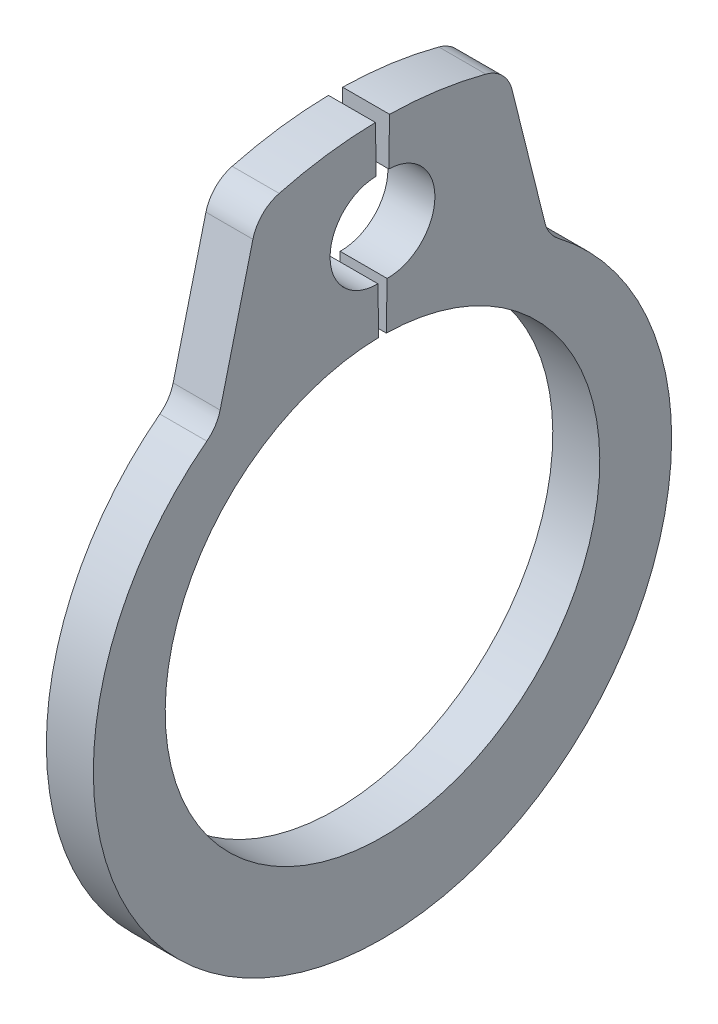
ISO-10303-21;
HEADER;
FILE_DESCRIPTION(('STEP AP214'),'2;1');
FILE_NAME('part.step','',(''),(''),'','','');
FILE_SCHEMA(('AUTOMOTIVE_DESIGN { 1 0 10303 214 1 1 1 1 }'));
ENDSEC;
DATA;
#1=APPLICATION_CONTEXT('core data for automotive mechanical design processes');
#2=APPLICATION_PROTOCOL_DEFINITION('international standard','automotive_design',2000,#1);
#3=PRODUCT_CONTEXT('',#1,'mechanical');
#4=PRODUCT('Part','Part','',(#3));
#5=PRODUCT_RELATED_PRODUCT_CATEGORY('part','',(#4));
#6=PRODUCT_DEFINITION_FORMATION('','',#4);
#7=PRODUCT_DEFINITION_CONTEXT('part definition',#1,'design');
#8=PRODUCT_DEFINITION('design','',#6,#7);
#9=PRODUCT_DEFINITION_SHAPE('','',#8);
#10=(LENGTH_UNIT() NAMED_UNIT(*) SI_UNIT(.MILLI.,.METRE.));
#11=(NAMED_UNIT(*) PLANE_ANGLE_UNIT() SI_UNIT($,.RADIAN.));
#12=(NAMED_UNIT(*) SI_UNIT($,.STERADIAN.) SOLID_ANGLE_UNIT());
#13=UNCERTAINTY_MEASURE_WITH_UNIT(LENGTH_MEASURE(1.E-05),#10,'distance_accuracy_value','');
#14=(GEOMETRIC_REPRESENTATION_CONTEXT(3) GLOBAL_UNCERTAINTY_ASSIGNED_CONTEXT((#13)) GLOBAL_UNIT_ASSIGNED_CONTEXT((#10,
#11,#12)) REPRESENTATION_CONTEXT('',''));
#15=CARTESIAN_POINT('',(0.,0.,0.));
#16=DIRECTION('',(0.,0.,1.));
#17=DIRECTION('',(1.,0.,0.));
#18=AXIS2_PLACEMENT_3D('',#15,#16,#17);
#19=CARTESIAN_POINT('',(0.4,0.,0.));
#20=DIRECTION('',(-1.,0.,0.));
#21=DIRECTION('',(0.,0.,1.));
#22=AXIS2_PLACEMENT_3D('',#19,#20,#21);
#23=CYLINDRICAL_SURFACE('',#22,3.7);
#24=CARTESIAN_POINT('',(-0.4,0.,0.));
#25=DIRECTION('',(-1.,0.,0.));
#26=DIRECTION('',(0.,0.,-1.));
#27=AXIS2_PLACEMENT_3D('',#24,#25,#26);
#28=CIRCLE('',#27,3.7);
#29=CARTESIAN_POINT('',(-0.4,3.69943647207865,-0.0645739038179491));
#30=VERTEX_POINT('',#29);
#31=CARTESIAN_POINT('',(-0.4,3.69943647207865,0.0645739038179491));
#32=VERTEX_POINT('',#31);
#33=EDGE_CURVE('E171',#30,#32,#28,.T.);
#34=ORIENTED_EDGE('',*,*,#33,.T.);
#35=DIRECTION('',(-1.,0.,0.));
#36=VECTOR('',#35,1.);
#37=CARTESIAN_POINT('',(0.4,3.69943647207865,0.0645739038179491));
#38=LINE('',#37,#36);
#39=CARTESIAN_POINT('',(0.4,3.69943647207865,0.0645739038179491));
#40=VERTEX_POINT('',#39);
#41=EDGE_CURVE('E152',#40,#32,#38,.T.);
#42=ORIENTED_EDGE('',*,*,#41,.F.);
#43=CARTESIAN_POINT('',(0.4,0.,0.));
#44=DIRECTION('',(-1.,0.,0.));
#45=DIRECTION('',(0.,0.,-1.));
#46=AXIS2_PLACEMENT_3D('',#43,#44,#45);
#47=CIRCLE('',#46,3.7);
#48=CARTESIAN_POINT('',(0.4,3.69943647207865,-0.0645739038179491));
#49=VERTEX_POINT('',#48);
#50=EDGE_CURVE('E158',#49,#40,#47,.T.);
#51=ORIENTED_EDGE('',*,*,#50,.F.);
#52=DIRECTION('',(-1.,0.,0.));
#53=VECTOR('',#52,1.);
#54=CARTESIAN_POINT('',(0.4,3.69943647207865,-0.0645739038179491));
#55=LINE('',#54,#53);
#56=EDGE_CURVE('E240',#49,#30,#55,.T.);
#57=ORIENTED_EDGE('',*,*,#56,.T.);
#58=EDGE_LOOP('',(#34,#42,#51,#57));
#59=FACE_BOUND('',#58,.T.);
#60=ADVANCED_FACE('F34',(#59),#23,.F.);
#61=CARTESIAN_POINT('',(0.4,4.49931462820376,0.078535828967776));
#62=DIRECTION('',(0.,-0.0174524064372836,0.999847695156391));
#63=DIRECTION('',(0.,-0.999847695156391,-0.0174524064372836));
#64=AXIS2_PLACEMENT_3D('',#61,#62,#63);
#65=PLANE('',#64);
#66=DIRECTION('',(0.,0.999847695156391,0.0174524064372836));
#67=VECTOR('',#66,1.);
#68=CARTESIAN_POINT('',(-0.4,4.49931462820376,0.078535828967776));
#69=LINE('',#68,#67);
#70=CARTESIAN_POINT('',(-0.4,4.49931462820376,0.078535828967776));
#71=VERTEX_POINT('',#70);
#72=EDGE_CURVE('E242',#32,#71,#69,.T.);
#73=ORIENTED_EDGE('',*,*,#72,.T.);
#74=DIRECTION('',(-1.,0.,0.));
#75=VECTOR('',#74,1.);
#76=CARTESIAN_POINT('',(0.4,4.49931462820376,0.078535828967776));
#77=LINE('',#76,#75);
#78=CARTESIAN_POINT('',(0.4,4.49931462820376,0.078535828967776));
#79=VERTEX_POINT('',#78);
#80=EDGE_CURVE('E155',#79,#71,#77,.T.);
#81=ORIENTED_EDGE('',*,*,#80,.F.);
#82=DIRECTION('',(0.,0.999847695156391,0.0174524064372836));
#83=VECTOR('',#82,1.);
#84=CARTESIAN_POINT('',(0.4,4.49931462820376,0.078535828967776));
#85=LINE('',#84,#83);
#86=EDGE_CURVE('E148',#40,#79,#85,.T.);
#87=ORIENTED_EDGE('',*,*,#86,.F.);
#88=ORIENTED_EDGE('',*,*,#41,.T.);
#89=EDGE_LOOP('',(#73,#81,#87,#88));
#90=FACE_BOUND('',#89,.T.);
#91=ADVANCED_FACE('F150',(#90),#65,.F.);
#92=CARTESIAN_POINT('',(0.4,5.29919278432887,0.0924977541176028));
#93=DIRECTION('',(-1.,0.,0.));
#94=DIRECTION('',(0.,0.,1.));
#95=AXIS2_PLACEMENT_3D('',#92,#93,#94);
#96=CYLINDRICAL_SURFACE('',#95,0.8);
#97=CARTESIAN_POINT('',(-0.4,5.29919278432887,0.0924977541176028));
#98=DIRECTION('',(-1.,0.,0.));
#99=DIRECTION('',(0.,0.,1.));
#100=AXIS2_PLACEMENT_3D('',#97,#98,#99);
#101=CIRCLE('',#100,0.8);
#102=CARTESIAN_POINT('',(-0.4,6.09907094045399,0.10645967926743));
#103=VERTEX_POINT('',#102);
#104=EDGE_CURVE('E244',#71,#103,#101,.T.);
#105=ORIENTED_EDGE('',*,*,#104,.T.);
#106=DIRECTION('',(-1.,0.,0.));
#107=VECTOR('',#106,1.);
#108=CARTESIAN_POINT('',(0.4,6.09907094045399,0.10645967926743));
#109=LINE('',#108,#107);
#110=CARTESIAN_POINT('',(0.4,6.09907094045399,0.10645967926743));
#111=VERTEX_POINT('',#110);
#112=EDGE_CURVE('E176',#111,#103,#109,.T.);
#113=ORIENTED_EDGE('',*,*,#112,.F.);
#114=CARTESIAN_POINT('',(0.4,5.29919278432887,0.0924977541176028));
#115=DIRECTION('',(-1.,0.,0.));
#116=DIRECTION('',(0.,0.,1.));
#117=AXIS2_PLACEMENT_3D('',#114,#115,#116);
#118=CIRCLE('',#117,0.8);
#119=EDGE_CURVE('E157',#79,#111,#118,.T.);
#120=ORIENTED_EDGE('',*,*,#119,.F.);
#121=ORIENTED_EDGE('',*,*,#80,.T.);
#122=EDGE_LOOP('',(#105,#113,#120,#121));
#123=FACE_BOUND('',#122,.T.);
#124=ADVANCED_FACE('F302',(#123),#96,.F.);
#125=CARTESIAN_POINT('',(0.4,6.09907094045399,0.10645967926743));
#126=DIRECTION('',(0.,-0.0174524064372835,0.999847695156391));
#127=DIRECTION('',(0.,-0.999847695156391,-0.0174524064372835));
#128=AXIS2_PLACEMENT_3D('',#125,#126,#127);
#129=PLANE('',#128);
#130=DIRECTION('',(0.,0.999847695156391,0.0174524064372835));
#131=VECTOR('',#130,1.);
#132=CARTESIAN_POINT('',(-0.4,6.09907094045399,0.10645967926743));
#133=LINE('',#132,#131);
#134=CARTESIAN_POINT('',(-0.4,6.8989490965791,0.120421604417257));
#135=VERTEX_POINT('',#134);
#136=EDGE_CURVE('E246',#103,#135,#133,.T.);
#137=ORIENTED_EDGE('',*,*,#136,.T.);
#138=DIRECTION('',(-1.,0.,0.));
#139=VECTOR('',#138,1.);
#140=CARTESIAN_POINT('',(0.4,6.8989490965791,0.120421604417257));
#141=LINE('',#140,#139);
#142=CARTESIAN_POINT('',(0.4,6.8989490965791,0.120421604417257));
#143=VERTEX_POINT('',#142);
#144=EDGE_CURVE('E271',#143,#135,#141,.T.);
#145=ORIENTED_EDGE('',*,*,#144,.F.);
#146=DIRECTION('',(0.,0.999847695156391,0.0174524064372835));
#147=VECTOR('',#146,1.);
#148=CARTESIAN_POINT('',(0.4,6.09907094045399,0.10645967926743));
#149=LINE('',#148,#147);
#150=EDGE_CURVE('E280',#111,#143,#149,.T.);
#151=ORIENTED_EDGE('',*,*,#150,.F.);
#152=ORIENTED_EDGE('',*,*,#112,.T.);
#153=EDGE_LOOP('',(#137,#145,#151,#152));
#154=FACE_BOUND('',#153,.T.);
#155=ADVANCED_FACE('F278',(#154),#129,.F.);
#156=CARTESIAN_POINT('',(0.4,-2.11522560488977E-13,0.));
#157=DIRECTION('',(-1.,0.,0.));
#158=DIRECTION('',(0.,0.,1.));
#159=AXIS2_PLACEMENT_3D('',#156,#157,#158);
#160=CYLINDRICAL_SURFACE('',#159,6.90000000000022);
#161=CARTESIAN_POINT('',(-0.4,-2.11522560488977E-13,0.));
#162=DIRECTION('',(1.,0.,0.));
#163=DIRECTION('',(0.,0.,-1.));
#164=AXIS2_PLACEMENT_3D('',#161,#162,#163);
#165=CIRCLE('',#164,6.90000000000022);
#166=CARTESIAN_POINT('',(-0.4,6.67190391529745,1.75945961733673));
#167=VERTEX_POINT('',#166);
#168=EDGE_CURVE('E248',#135,#167,#165,.T.);
#169=ORIENTED_EDGE('',*,*,#168,.T.);
#170=DIRECTION('',(-1.,0.,0.));
#171=VECTOR('',#170,1.);
#172=CARTESIAN_POINT('',(0.4,6.67190391529745,1.75945961733673));
#173=LINE('',#172,#171);
#174=CARTESIAN_POINT('',(0.4,6.67190391529745,1.75945961733673));
#175=VERTEX_POINT('',#174);
#176=EDGE_CURVE('E191',#167,#175,#173,.F.);
#177=ORIENTED_EDGE('',*,*,#176,.T.);
#178=CARTESIAN_POINT('',(0.4,-2.11522560488977E-13,0.));
#179=DIRECTION('',(1.,0.,0.));
#180=DIRECTION('',(0.,0.,-1.));
#181=AXIS2_PLACEMENT_3D('',#178,#179,#180);
#182=CIRCLE('',#181,6.90000000000022);
#183=EDGE_CURVE('E295',#143,#175,#182,.T.);
#184=ORIENTED_EDGE('',*,*,#183,.F.);
#185=ORIENTED_EDGE('',*,*,#144,.T.);
#186=EDGE_LOOP('',(#169,#177,#184,#185));
#187=FACE_BOUND('',#186,.T.);
#188=ADVANCED_FACE('F286',(#187),#160,.T.);
#189=CARTESIAN_POINT('',(0.4,6.56628693047855,2.11987639890321));
#190=DIRECTION('',(0.,-0.241921895599665,-0.970295726275997));
#191=DIRECTION('',(0.,0.970295726275997,-0.241921895599665));
#192=AXIS2_PLACEMENT_3D('',#189,#190,#191);
#193=PLANE('',#192);
#194=DIRECTION('',(0.,-0.970295726275997,0.241921895599665));
#195=VECTOR('',#194,1.);
#196=CARTESIAN_POINT('',(-0.4,6.56628693047855,2.11987639890321));
#197=LINE('',#196,#195);
#198=CARTESIAN_POINT('',(-0.4,6.21876597728479,2.20652310410917));
#199=VERTEX_POINT('',#198);
#200=CARTESIAN_POINT('',(-0.4,3.97987024893415,2.76474250463295));
#201=VERTEX_POINT('',#200);
#202=EDGE_CURVE('E222',#199,#201,#197,.T.);
#203=ORIENTED_EDGE('',*,*,#202,.T.);
#204=DIRECTION('',(1.,0.,0.));
#205=VECTOR('',#204,1.);
#206=CARTESIAN_POINT('',(0.4,3.97987024893415,2.76474250463295));
#207=LINE('',#206,#205);
#208=CARTESIAN_POINT('',(0.4,3.97987024893415,2.76474250463295));
#209=VERTEX_POINT('',#208);
#210=EDGE_CURVE('E185',#201,#209,#207,.T.);
#211=ORIENTED_EDGE('',*,*,#210,.T.);
#212=DIRECTION('',(0.,-0.970295726275997,0.241921895599665));
#213=VECTOR('',#212,1.);
#214=CARTESIAN_POINT('',(0.4,6.56628693047855,2.11987639890321));
#215=LINE('',#214,#213);
#216=CARTESIAN_POINT('',(0.4,6.21876597728479,2.20652310410917));
#217=VERTEX_POINT('',#216);
#218=EDGE_CURVE('E232',#217,#209,#215,.T.);
#219=ORIENTED_EDGE('',*,*,#218,.F.);
#220=DIRECTION('',(-1.,0.,0.));
#221=VECTOR('',#220,1.);
#222=CARTESIAN_POINT('',(0.4,6.21876597728479,2.20652310410917));
#223=LINE('',#222,#221);
#224=EDGE_CURVE('E182',#217,#199,#223,.T.);
#225=ORIENTED_EDGE('',*,*,#224,.T.);
#226=EDGE_LOOP('',(#203,#211,#219,#225));
#227=FACE_BOUND('',#226,.T.);
#228=ADVANCED_FACE('F297',(#227),#193,.F.);
#229=CARTESIAN_POINT('',(0.4,-0.276215233697221,0.));
#230=DIRECTION('',(-1.,0.,0.));
#231=DIRECTION('',(0.,0.,1.));
#232=AXIS2_PLACEMENT_3D('',#229,#230,#231);
#233=CYLINDRICAL_SURFACE('',#232,4.92378476630278);
#234=CARTESIAN_POINT('',(0.4,-0.276215233697221,0.));
#235=DIRECTION('',(1.,0.,0.));
#236=DIRECTION('',(0.,0.,-1.));
#237=AXIS2_PLACEMENT_3D('',#234,#235,#236);
#238=CIRCLE('',#237,4.92378476630278);
#239=CARTESIAN_POINT('',(0.4,3.63464666986154,2.99145710251177));
#240=VERTEX_POINT('',#239);
#241=CARTESIAN_POINT('',(0.4,3.63464666986153,-2.99145710251178));
#242=VERTEX_POINT('',#241);
#243=EDGE_CURVE('E226',#240,#242,#238,.T.);
#244=ORIENTED_EDGE('',*,*,#243,.F.);
#245=DIRECTION('',(-1.,0.,0.));
#246=VECTOR('',#245,1.);
#247=CARTESIAN_POINT('',(0.4,3.63464666986154,2.99145710251177));
#248=LINE('',#247,#246);
#249=CARTESIAN_POINT('',(-0.4,3.63464666986154,2.99145710251177));
#250=VERTEX_POINT('',#249);
#251=EDGE_CURVE('E174',#240,#250,#248,.T.);
#252=ORIENTED_EDGE('',*,*,#251,.T.);
#253=CARTESIAN_POINT('',(-0.4,-0.276215233697221,0.));
#254=DIRECTION('',(1.,0.,0.));
#255=DIRECTION('',(0.,0.,-1.));
#256=AXIS2_PLACEMENT_3D('',#253,#254,#255);
#257=CIRCLE('',#256,4.92378476630278);
#258=CARTESIAN_POINT('',(-0.4,3.63464666986153,-2.99145710251178));
#259=VERTEX_POINT('',#258);
#260=EDGE_CURVE('E212',#250,#259,#257,.T.);
#261=ORIENTED_EDGE('',*,*,#260,.T.);
#262=DIRECTION('',(-1.,0.,0.));
#263=VECTOR('',#262,1.);
#264=CARTESIAN_POINT('',(0.4,3.63464666986153,-2.99145710251178));
#265=LINE('',#264,#263);
#266=EDGE_CURVE('E172',#259,#242,#265,.F.);
#267=ORIENTED_EDGE('',*,*,#266,.T.);
#268=EDGE_LOOP('',(#244,#252,#261,#267));
#269=FACE_BOUND('',#268,.T.);
#270=ADVANCED_FACE('F219',(#269),#233,.T.);
#271=CARTESIAN_POINT('',(0.4,6.56628693047853,-2.11987639890323));
#272=DIRECTION('',(0.,-0.24192189559966,0.970295726275998));
#273=DIRECTION('',(0.,-0.970295726275998,-0.24192189559966));
#274=AXIS2_PLACEMENT_3D('',#271,#272,#273);
#275=PLANE('',#274);
#276=DIRECTION('',(0.,0.970295726275998,0.24192189559966));
#277=VECTOR('',#276,1.);
#278=CARTESIAN_POINT('',(-0.4,6.56628693047853,-2.11987639890323));
#279=LINE('',#278,#277);
#280=CARTESIAN_POINT('',(-0.4,3.97987024893415,-2.76474250463296));
#281=VERTEX_POINT('',#280);
#282=CARTESIAN_POINT('',(-0.4,6.21876597728477,-2.20652310410919));
#283=VERTEX_POINT('',#282);
#284=EDGE_CURVE('E213',#281,#283,#279,.T.);
#285=ORIENTED_EDGE('',*,*,#284,.T.);
#286=DIRECTION('',(-1.,0.,0.));
#287=VECTOR('',#286,1.);
#288=CARTESIAN_POINT('',(0.4,6.21876597728477,-2.20652310410919));
#289=LINE('',#288,#287);
#290=CARTESIAN_POINT('',(0.4,6.21876597728477,-2.20652310410919));
#291=VERTEX_POINT('',#290);
#292=EDGE_CURVE('E57',#283,#291,#289,.F.);
#293=ORIENTED_EDGE('',*,*,#292,.T.);
#294=DIRECTION('',(0.,0.970295726275998,0.24192189559966));
#295=VECTOR('',#294,1.);
#296=CARTESIAN_POINT('',(0.4,6.56628693047853,-2.11987639890323));
#297=LINE('',#296,#295);
#298=CARTESIAN_POINT('',(0.4,3.97987024893415,-2.76474250463296));
#299=VERTEX_POINT('',#298);
#300=EDGE_CURVE('E225',#299,#291,#297,.T.);
#301=ORIENTED_EDGE('',*,*,#300,.F.);
#302=DIRECTION('',(1.,0.,0.));
#303=VECTOR('',#302,1.);
#304=CARTESIAN_POINT('',(-0.4,3.97987024893415,-2.76474250463296));
#305=LINE('',#304,#303);
#306=EDGE_CURVE('E199',#299,#281,#305,.F.);
#307=ORIENTED_EDGE('',*,*,#306,.T.);
#308=EDGE_LOOP('',(#285,#293,#301,#307));
#309=FACE_BOUND('',#308,.T.);
#310=ADVANCED_FACE('F227',(#309),#275,.F.);
#311=CARTESIAN_POINT('',(0.4,0.,0.));
#312=DIRECTION('',(-1.,0.,0.));
#313=DIRECTION('',(0.,0.,1.));
#314=AXIS2_PLACEMENT_3D('',#311,#312,#313);
#315=CYLINDRICAL_SURFACE('',#314,6.9);
#316=CARTESIAN_POINT('',(0.4,0.,0.));
#317=DIRECTION('',(1.,0.,0.));
#318=DIRECTION('',(0.,0.,1.));
#319=AXIS2_PLACEMENT_3D('',#316,#317,#318);
#320=CIRCLE('',#319,6.9);
#321=CARTESIAN_POINT('',(0.4,6.67190391529743,-1.75945961733676));
#322=VERTEX_POINT('',#321);
#323=CARTESIAN_POINT('',(0.4,6.8989490965791,-0.120421604417259));
#324=VERTEX_POINT('',#323);
#325=EDGE_CURVE('E228',#322,#324,#320,.T.);
#326=ORIENTED_EDGE('',*,*,#325,.F.);
#327=DIRECTION('',(-1.,0.,0.));
#328=VECTOR('',#327,1.);
#329=CARTESIAN_POINT('',(0.4,6.67190391529744,-1.75945961733676));
#330=LINE('',#329,#328);
#331=CARTESIAN_POINT('',(-0.4,6.67190391529743,-1.75945961733676));
#332=VERTEX_POINT('',#331);
#333=EDGE_CURVE('E196',#322,#332,#330,.T.);
#334=ORIENTED_EDGE('',*,*,#333,.T.);
#335=CARTESIAN_POINT('',(-0.4,0.,0.));
#336=DIRECTION('',(1.,0.,0.));
#337=DIRECTION('',(0.,0.,1.));
#338=AXIS2_PLACEMENT_3D('',#335,#336,#337);
#339=CIRCLE('',#338,6.9);
#340=CARTESIAN_POINT('',(-0.4,6.8989490965791,-0.120421604417259));
#341=VERTEX_POINT('',#340);
#342=EDGE_CURVE('E254',#332,#341,#339,.T.);
#343=ORIENTED_EDGE('',*,*,#342,.T.);
#344=DIRECTION('',(-1.,0.,0.));
#345=VECTOR('',#344,1.);
#346=CARTESIAN_POINT('',(0.4,6.8989490965791,-0.120421604417259));
#347=LINE('',#346,#345);
#348=EDGE_CURVE('E268',#324,#341,#347,.T.);
#349=ORIENTED_EDGE('',*,*,#348,.F.);
#350=EDGE_LOOP('',(#326,#334,#343,#349));
#351=FACE_BOUND('',#350,.T.);
#352=ADVANCED_FACE('F330',(#351),#315,.T.);
#353=CARTESIAN_POINT('',(0.4,6.09907094045399,-0.106459679267431));
#354=DIRECTION('',(0.,-0.0174524064372838,-0.999847695156391));
#355=DIRECTION('',(0.,0.999847695156391,-0.0174524064372838));
#356=AXIS2_PLACEMENT_3D('',#353,#354,#355);
#357=PLANE('',#356);
#358=DIRECTION('',(0.,-0.999847695156391,0.0174524064372838));
#359=VECTOR('',#358,1.);
#360=CARTESIAN_POINT('',(-0.4,6.09907094045399,-0.106459679267431));
#361=LINE('',#360,#359);
#362=CARTESIAN_POINT('',(-0.4,6.09907094045399,-0.106459679267431));
#363=VERTEX_POINT('',#362);
#364=EDGE_CURVE('E256',#341,#363,#361,.T.);
#365=ORIENTED_EDGE('',*,*,#364,.T.);
#366=DIRECTION('',(-1.,0.,0.));
#367=VECTOR('',#366,1.);
#368=CARTESIAN_POINT('',(0.4,6.09907094045399,-0.106459679267431));
#369=LINE('',#368,#367);
#370=CARTESIAN_POINT('',(0.4,6.09907094045399,-0.106459679267431));
#371=VERTEX_POINT('',#370);
#372=EDGE_CURVE('E265',#371,#363,#369,.T.);
#373=ORIENTED_EDGE('',*,*,#372,.F.);
#374=DIRECTION('',(0.,-0.999847695156391,0.0174524064372838));
#375=VECTOR('',#374,1.);
#376=CARTESIAN_POINT('',(0.4,6.09907094045399,-0.106459679267431));
#377=LINE('',#376,#375);
#378=EDGE_CURVE('E230',#324,#371,#377,.T.);
#379=ORIENTED_EDGE('',*,*,#378,.F.);
#380=ORIENTED_EDGE('',*,*,#348,.T.);
#381=EDGE_LOOP('',(#365,#373,#379,#380));
#382=FACE_BOUND('',#381,.T.);
#383=ADVANCED_FACE('F337',(#382),#357,.F.);
#384=CARTESIAN_POINT('',(0.4,5.29919278432887,-0.0924977541176043));
#385=DIRECTION('',(-1.,0.,0.));
#386=DIRECTION('',(0.,0.,1.));
#387=AXIS2_PLACEMENT_3D('',#384,#385,#386);
#388=CYLINDRICAL_SURFACE('',#387,0.8);
#389=CARTESIAN_POINT('',(-0.4,5.29919278432887,-0.0924977541176043));
#390=DIRECTION('',(-1.,0.,0.));
#391=DIRECTION('',(0.,0.,1.));
#392=AXIS2_PLACEMENT_3D('',#389,#390,#391);
#393=CIRCLE('',#392,0.8);
#394=CARTESIAN_POINT('',(-0.4,4.49931462820376,-0.0785358289677771));
#395=VERTEX_POINT('',#394);
#396=EDGE_CURVE('E258',#363,#395,#393,.T.);
#397=ORIENTED_EDGE('',*,*,#396,.T.);
#398=DIRECTION('',(-1.,0.,0.));
#399=VECTOR('',#398,1.);
#400=CARTESIAN_POINT('',(0.4,4.49931462820376,-0.0785358289677771));
#401=LINE('',#400,#399);
#402=CARTESIAN_POINT('',(0.4,4.49931462820376,-0.0785358289677771));
#403=VERTEX_POINT('',#402);
#404=EDGE_CURVE('E262',#403,#395,#401,.T.);
#405=ORIENTED_EDGE('',*,*,#404,.F.);
#406=CARTESIAN_POINT('',(0.4,5.29919278432887,-0.0924977541176043));
#407=DIRECTION('',(-1.,0.,0.));
#408=DIRECTION('',(0.,0.,1.));
#409=AXIS2_PLACEMENT_3D('',#406,#407,#408);
#410=CIRCLE('',#409,0.8);
#411=EDGE_CURVE('E237',#371,#403,#410,.T.);
#412=ORIENTED_EDGE('',*,*,#411,.F.);
#413=ORIENTED_EDGE('',*,*,#372,.T.);
#414=EDGE_LOOP('',(#397,#405,#412,#413));
#415=FACE_BOUND('',#414,.T.);
#416=ADVANCED_FACE('F341',(#415),#388,.F.);
#417=CARTESIAN_POINT('',(0.4,3.69943647207865,-0.0645739038179491));
#418=DIRECTION('',(0.,-0.0174524064372851,-0.999847695156391));
#419=DIRECTION('',(0.,0.999847695156391,-0.0174524064372851));
#420=AXIS2_PLACEMENT_3D('',#417,#418,#419);
#421=PLANE('',#420);
#422=DIRECTION('',(0.,-0.999847695156391,0.0174524064372851));
#423=VECTOR('',#422,1.);
#424=CARTESIAN_POINT('',(-0.4,3.69943647207865,-0.0645739038179491));
#425=LINE('',#424,#423);
#426=EDGE_CURVE('E168',#395,#30,#425,.T.);
#427=ORIENTED_EDGE('',*,*,#426,.T.);
#428=ORIENTED_EDGE('',*,*,#56,.F.);
#429=DIRECTION('',(0.,-0.999847695156391,0.0174524064372851));
#430=VECTOR('',#429,1.);
#431=CARTESIAN_POINT('',(0.4,3.69943647207865,-0.0645739038179491));
#432=LINE('',#431,#430);
#433=EDGE_CURVE('E164',#403,#49,#432,.T.);
#434=ORIENTED_EDGE('',*,*,#433,.F.);
#435=ORIENTED_EDGE('',*,*,#404,.T.);
#436=EDGE_LOOP('',(#427,#428,#434,#435));
#437=FACE_BOUND('',#436,.T.);
#438=ADVANCED_FACE('F344',(#437),#421,.F.);
#439=CARTESIAN_POINT('',(0.4,0.,0.));
#440=DIRECTION('',(1.,0.,0.));
#441=DIRECTION('',(0.,0.,-1.));
#442=AXIS2_PLACEMENT_3D('',#439,#440,#441);
#443=PLANE('',#442);
#444=ORIENTED_EDGE('',*,*,#183,.T.);
#445=CARTESIAN_POINT('',(0.4,6.067564792535,1.60008827518667));
#446=DIRECTION('',(1.,0.,0.));
#447=DIRECTION('',(0.,0.,-1.));
#448=AXIS2_PLACEMENT_3D('',#445,#446,#447);
#449=CIRCLE('',#448,0.625);
#450=EDGE_CURVE('E194',#175,#217,#449,.T.);
#451=ORIENTED_EDGE('',*,*,#450,.T.);
#452=ORIENTED_EDGE('',*,*,#218,.T.);
#453=CARTESIAN_POINT('',(0.4,4.13107143368394,3.37117733355545));
#454=DIRECTION('',(1.,0.,0.));
#455=DIRECTION('',(0.,0.,-1.));
#456=AXIS2_PLACEMENT_3D('',#453,#454,#455);
#457=CIRCLE('',#456,0.625);
#458=EDGE_CURVE('E205',#209,#240,#457,.F.);
#459=ORIENTED_EDGE('',*,*,#458,.T.);
#460=ORIENTED_EDGE('',*,*,#243,.T.);
#461=CARTESIAN_POINT('',(0.4,4.13107143368394,-3.37117733355546));
#462=DIRECTION('',(1.,0.,0.));
#463=DIRECTION('',(0.,0.,-1.));
#464=AXIS2_PLACEMENT_3D('',#461,#462,#463);
#465=CIRCLE('',#464,0.625);
#466=EDGE_CURVE('E11',#242,#299,#465,.F.);
#467=ORIENTED_EDGE('',*,*,#466,.T.);
#468=ORIENTED_EDGE('',*,*,#300,.T.);
#469=CARTESIAN_POINT('',(0.4,6.06756479253499,-1.60008827518669));
#470=DIRECTION('',(1.,0.,0.));
#471=DIRECTION('',(0.,0.,-1.));
#472=AXIS2_PLACEMENT_3D('',#469,#470,#471);
#473=CIRCLE('',#472,0.625);
#474=EDGE_CURVE('E49',#291,#322,#473,.T.);
#475=ORIENTED_EDGE('',*,*,#474,.T.);
#476=ORIENTED_EDGE('',*,*,#325,.T.);
#477=ORIENTED_EDGE('',*,*,#378,.T.);
#478=ORIENTED_EDGE('',*,*,#411,.T.);
#479=ORIENTED_EDGE('',*,*,#433,.T.);
#480=ORIENTED_EDGE('',*,*,#50,.T.);
#481=ORIENTED_EDGE('',*,*,#86,.T.);
#482=ORIENTED_EDGE('',*,*,#119,.T.);
#483=ORIENTED_EDGE('',*,*,#150,.T.);
#484=EDGE_LOOP('',(#444,#451,#452,#459,#460,#467,#468,#475,#476,#477,#478,#479,#480,#481,#482,#483));
#485=FACE_BOUND('',#484,.T.);
#486=ADVANCED_FACE('F162',(#485),#443,.T.);
#487=CARTESIAN_POINT('',(-0.4,0.,0.));
#488=DIRECTION('',(1.,0.,0.));
#489=DIRECTION('',(0.,0.,-1.));
#490=AXIS2_PLACEMENT_3D('',#487,#488,#489);
#491=PLANE('',#490);
#492=ORIENTED_EDGE('',*,*,#202,.F.);
#493=CARTESIAN_POINT('',(-0.4,6.067564792535,1.60008827518667));
#494=DIRECTION('',(1.,0.,0.));
#495=DIRECTION('',(0.,0.,-1.));
#496=AXIS2_PLACEMENT_3D('',#493,#494,#495);
#497=CIRCLE('',#496,0.625);
#498=EDGE_CURVE('E189',#199,#167,#497,.F.);
#499=ORIENTED_EDGE('',*,*,#498,.T.);
#500=ORIENTED_EDGE('',*,*,#168,.F.);
#501=ORIENTED_EDGE('',*,*,#136,.F.);
#502=ORIENTED_EDGE('',*,*,#104,.F.);
#503=ORIENTED_EDGE('',*,*,#72,.F.);
#504=ORIENTED_EDGE('',*,*,#33,.F.);
#505=ORIENTED_EDGE('',*,*,#426,.F.);
#506=ORIENTED_EDGE('',*,*,#396,.F.);
#507=ORIENTED_EDGE('',*,*,#364,.F.);
#508=ORIENTED_EDGE('',*,*,#342,.F.);
#509=CARTESIAN_POINT('',(-0.4,6.06756479253499,-1.60008827518669));
#510=DIRECTION('',(1.,0.,0.));
#511=DIRECTION('',(0.,0.,-1.));
#512=AXIS2_PLACEMENT_3D('',#509,#510,#511);
#513=CIRCLE('',#512,0.625);
#514=EDGE_CURVE('E187',#332,#283,#513,.F.);
#515=ORIENTED_EDGE('',*,*,#514,.T.);
#516=ORIENTED_EDGE('',*,*,#284,.F.);
#517=CARTESIAN_POINT('',(-0.4,4.13107143368394,-3.37117733355546));
#518=DIRECTION('',(1.,0.,0.));
#519=DIRECTION('',(0.,0.,-1.));
#520=AXIS2_PLACEMENT_3D('',#517,#518,#519);
#521=CIRCLE('',#520,0.625);
#522=EDGE_CURVE('E42',#281,#259,#521,.T.);
#523=ORIENTED_EDGE('',*,*,#522,.T.);
#524=ORIENTED_EDGE('',*,*,#260,.F.);
#525=CARTESIAN_POINT('',(-0.4,4.13107143368394,3.37117733355545));
#526=DIRECTION('',(1.,0.,0.));
#527=DIRECTION('',(0.,0.,-1.));
#528=AXIS2_PLACEMENT_3D('',#525,#526,#527);
#529=CIRCLE('',#528,0.625);
#530=EDGE_CURVE('E203',#250,#201,#529,.T.);
#531=ORIENTED_EDGE('',*,*,#530,.T.);
#532=EDGE_LOOP('',(#492,#499,#500,#501,#502,#503,#504,#505,#506,#507,#508,#515,#516,#523,#524,#531));
#533=FACE_BOUND('',#532,.T.);
#534=ADVANCED_FACE('F211',(#533),#491,.F.);
#535=CARTESIAN_POINT('',(0.4,4.13107143368394,3.37117733355545));
#536=DIRECTION('',(-1.,0.,0.));
#537=DIRECTION('',(0.,0.,1.));
#538=AXIS2_PLACEMENT_3D('',#535,#536,#537);
#539=CYLINDRICAL_SURFACE('',#538,0.625);
#540=ORIENTED_EDGE('',*,*,#458,.F.);
#541=ORIENTED_EDGE('',*,*,#210,.F.);
#542=ORIENTED_EDGE('',*,*,#530,.F.);
#543=ORIENTED_EDGE('',*,*,#251,.F.);
#544=EDGE_LOOP('',(#540,#541,#542,#543));
#545=FACE_BOUND('',#544,.T.);
#546=ADVANCED_FACE('F316',(#545),#539,.F.);
#547=CARTESIAN_POINT('',(0.4,6.067564792535,1.60008827518667));
#548=DIRECTION('',(-1.,0.,0.));
#549=DIRECTION('',(0.,0.,1.));
#550=AXIS2_PLACEMENT_3D('',#547,#548,#549);
#551=CYLINDRICAL_SURFACE('',#550,0.625);
#552=ORIENTED_EDGE('',*,*,#450,.F.);
#553=ORIENTED_EDGE('',*,*,#176,.F.);
#554=ORIENTED_EDGE('',*,*,#498,.F.);
#555=ORIENTED_EDGE('',*,*,#224,.F.);
#556=EDGE_LOOP('',(#552,#553,#554,#555));
#557=FACE_BOUND('',#556,.T.);
#558=ADVANCED_FACE('F290',(#557),#551,.T.);
#559=CARTESIAN_POINT('',(0.4,6.06756479253499,-1.60008827518669));
#560=DIRECTION('',(-1.,0.,0.));
#561=DIRECTION('',(0.,0.,1.));
#562=AXIS2_PLACEMENT_3D('',#559,#560,#561);
#563=CYLINDRICAL_SURFACE('',#562,0.625);
#564=ORIENTED_EDGE('',*,*,#474,.F.);
#565=ORIENTED_EDGE('',*,*,#292,.F.);
#566=ORIENTED_EDGE('',*,*,#514,.F.);
#567=ORIENTED_EDGE('',*,*,#333,.F.);
#568=EDGE_LOOP('',(#564,#565,#566,#567));
#569=FACE_BOUND('',#568,.T.);
#570=ADVANCED_FACE('F321',(#569),#563,.T.);
#571=CARTESIAN_POINT('',(0.4,4.13107143368394,-3.37117733355546));
#572=DIRECTION('',(-1.,0.,0.));
#573=DIRECTION('',(0.,0.,1.));
#574=AXIS2_PLACEMENT_3D('',#571,#572,#573);
#575=CYLINDRICAL_SURFACE('',#574,0.625);
#576=ORIENTED_EDGE('',*,*,#466,.F.);
#577=ORIENTED_EDGE('',*,*,#266,.F.);
#578=ORIENTED_EDGE('',*,*,#522,.F.);
#579=ORIENTED_EDGE('',*,*,#306,.F.);
#580=EDGE_LOOP('',(#576,#577,#578,#579));
#581=FACE_BOUND('',#580,.T.);
#582=ADVANCED_FACE('F36',(#581),#575,.F.);
#583=CLOSED_SHELL('',(#60,#91,#124,#155,#188,#228,#270,#310,#352,#383,#416,#438,#486,#534,#546,
#558,#570,#582));
#584=MANIFOLD_SOLID_BREP('B2',#583);
#585=ADVANCED_BREP_SHAPE_REPRESENTATION('',(#18,#584),#14);
#586=SHAPE_DEFINITION_REPRESENTATION(#9,#585);
ENDSEC;
END-ISO-10303-21;
